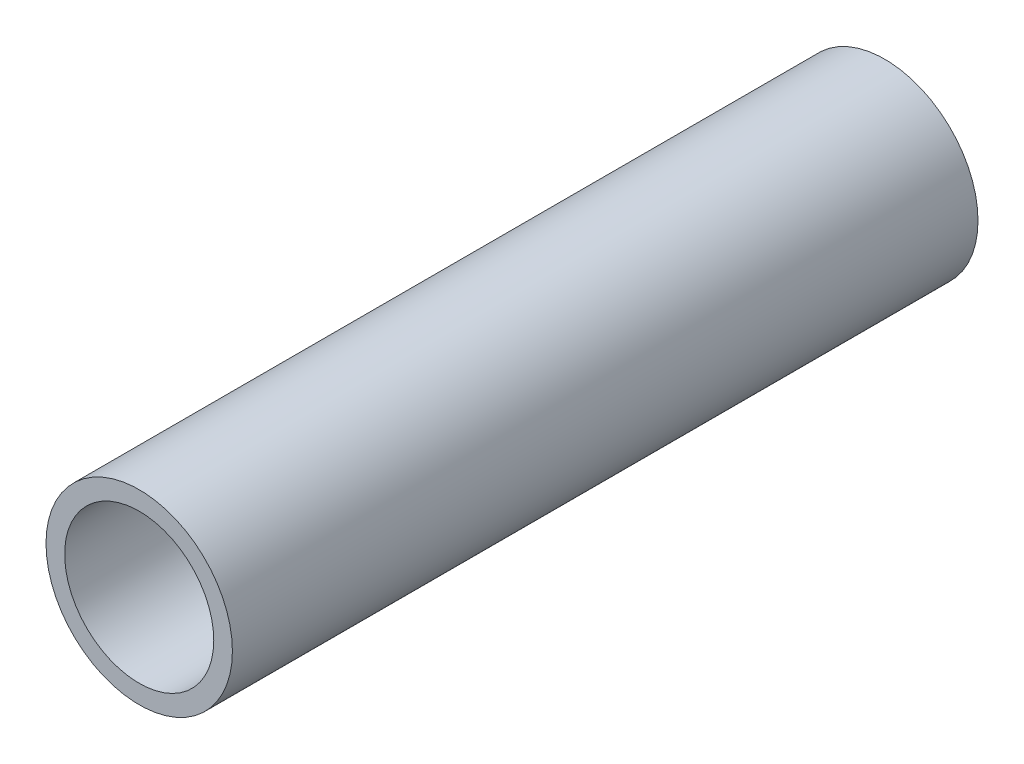
ISO-10303-21;
HEADER;
FILE_DESCRIPTION(('STEP AP214'),'2;1');
FILE_NAME('part.step','',(''),(''),'','','');
FILE_SCHEMA(('AUTOMOTIVE_DESIGN { 1 0 10303 214 1 1 1 1 }'));
ENDSEC;
DATA;
#1=APPLICATION_CONTEXT('core data for automotive mechanical design processes');
#2=APPLICATION_PROTOCOL_DEFINITION('international standard','automotive_design',2000,#1);
#3=PRODUCT_CONTEXT('',#1,'mechanical');
#4=PRODUCT('Part','Part','',(#3));
#5=PRODUCT_RELATED_PRODUCT_CATEGORY('part','',(#4));
#6=PRODUCT_DEFINITION_FORMATION('','',#4);
#7=PRODUCT_DEFINITION_CONTEXT('part definition',#1,'design');
#8=PRODUCT_DEFINITION('design','',#6,#7);
#9=PRODUCT_DEFINITION_SHAPE('','',#8);
#10=(LENGTH_UNIT() NAMED_UNIT(*) SI_UNIT(.MILLI.,.METRE.));
#11=(NAMED_UNIT(*) PLANE_ANGLE_UNIT() SI_UNIT($,.RADIAN.));
#12=(NAMED_UNIT(*) SI_UNIT($,.STERADIAN.) SOLID_ANGLE_UNIT());
#13=UNCERTAINTY_MEASURE_WITH_UNIT(LENGTH_MEASURE(1.E-05),#10,'distance_accuracy_value','');
#14=(GEOMETRIC_REPRESENTATION_CONTEXT(3) GLOBAL_UNCERTAINTY_ASSIGNED_CONTEXT((#13)) GLOBAL_UNIT_ASSIGNED_CONTEXT((#10,
#11,#12)) REPRESENTATION_CONTEXT('',''));
#15=CARTESIAN_POINT('',(0.,0.,0.));
#16=DIRECTION('',(0.,0.,1.));
#17=DIRECTION('',(1.,0.,0.));
#18=AXIS2_PLACEMENT_3D('',#15,#16,#17);
#19=CARTESIAN_POINT('',(0.,0.,-100.));
#20=DIRECTION('',(0.,0.,1.));
#21=DIRECTION('',(1.,0.,0.));
#22=AXIS2_PLACEMENT_3D('',#19,#20,#21);
#23=CYLINDRICAL_SURFACE('',#22,12.5);
#24=CARTESIAN_POINT('',(0.,0.,-100.));
#25=DIRECTION('',(0.,0.,1.));
#26=DIRECTION('',(1.,0.,0.));
#27=AXIS2_PLACEMENT_3D('',#24,#25,#26);
#28=CIRCLE('',#27,12.5);
#29=CARTESIAN_POINT('',(12.5,0.,-100.));
#30=VERTEX_POINT('',#29);
#31=EDGE_CURVE('E10',#30,#30,#28,.T.);
#32=ORIENTED_EDGE('',*,*,#31,.T.);
#33=EDGE_LOOP('',(#32));
#34=FACE_BOUND('',#33,.T.);
#35=CARTESIAN_POINT('',(0.,0.,0.));
#36=DIRECTION('',(0.,0.,1.));
#37=DIRECTION('',(1.,0.,0.));
#38=AXIS2_PLACEMENT_3D('',#35,#36,#37);
#39=CIRCLE('',#38,12.5);
#40=CARTESIAN_POINT('',(12.5,0.,0.));
#41=VERTEX_POINT('',#40);
#42=EDGE_CURVE('E37',#41,#41,#39,.T.);
#43=ORIENTED_EDGE('',*,*,#42,.F.);
#44=EDGE_LOOP('',(#43));
#45=FACE_BOUND('',#44,.T.);
#46=ADVANCED_FACE('F34',(#34,#45),#23,.T.);
#47=CARTESIAN_POINT('',(0.,0.,-100.));
#48=DIRECTION('',(0.,0.,1.));
#49=DIRECTION('',(1.,0.,0.));
#50=AXIS2_PLACEMENT_3D('',#47,#48,#49);
#51=PLANE('',#50);
#52=CARTESIAN_POINT('',(0.,0.,-100.));
#53=DIRECTION('',(0.,0.,1.));
#54=DIRECTION('',(1.,0.,0.));
#55=AXIS2_PLACEMENT_3D('',#52,#53,#54);
#56=CIRCLE('',#55,10.);
#57=CARTESIAN_POINT('',(10.,0.,-100.));
#58=VERTEX_POINT('',#57);
#59=EDGE_CURVE('E44',#58,#58,#56,.T.);
#60=ORIENTED_EDGE('',*,*,#59,.T.);
#61=EDGE_LOOP('',(#60));
#62=FACE_BOUND('',#61,.T.);
#63=ORIENTED_EDGE('',*,*,#31,.F.);
#64=EDGE_LOOP('',(#63));
#65=FACE_BOUND('',#64,.T.);
#66=ADVANCED_FACE('F52',(#62,#65),#51,.F.);
#67=CARTESIAN_POINT('',(0.,0.,0.));
#68=DIRECTION('',(0.,0.,1.));
#69=DIRECTION('',(1.,0.,0.));
#70=AXIS2_PLACEMENT_3D('',#67,#68,#69);
#71=PLANE('',#70);
#72=CARTESIAN_POINT('',(0.,0.,0.));
#73=DIRECTION('',(0.,0.,1.));
#74=DIRECTION('',(1.,0.,0.));
#75=AXIS2_PLACEMENT_3D('',#72,#73,#74);
#76=CIRCLE('',#75,10.);
#77=CARTESIAN_POINT('',(10.,0.,0.));
#78=VERTEX_POINT('',#77);
#79=EDGE_CURVE('E46',#78,#78,#76,.T.);
#80=ORIENTED_EDGE('',*,*,#79,.F.);
#81=EDGE_LOOP('',(#80));
#82=FACE_BOUND('',#81,.T.);
#83=ORIENTED_EDGE('',*,*,#42,.T.);
#84=EDGE_LOOP('',(#83));
#85=FACE_BOUND('',#84,.T.);
#86=ADVANCED_FACE('F58',(#82,#85),#71,.T.);
#87=CARTESIAN_POINT('',(0.,0.,-100.));
#88=DIRECTION('',(0.,0.,1.));
#89=DIRECTION('',(1.,0.,0.));
#90=AXIS2_PLACEMENT_3D('',#87,#88,#89);
#91=CYLINDRICAL_SURFACE('',#90,10.);
#92=ORIENTED_EDGE('',*,*,#59,.F.);
#93=EDGE_LOOP('',(#92));
#94=FACE_BOUND('',#93,.T.);
#95=ORIENTED_EDGE('',*,*,#79,.T.);
#96=EDGE_LOOP('',(#95));
#97=FACE_BOUND('',#96,.T.);
#98=ADVANCED_FACE('F55',(#94,#97),#91,.F.);
#99=CLOSED_SHELL('',(#46,#66,#86,#98));
#100=MANIFOLD_SOLID_BREP('B2',#99);
#101=ADVANCED_BREP_SHAPE_REPRESENTATION('',(#18,#100),#14);
#102=SHAPE_DEFINITION_REPRESENTATION(#9,#101);
ENDSEC;
END-ISO-10303-21;
